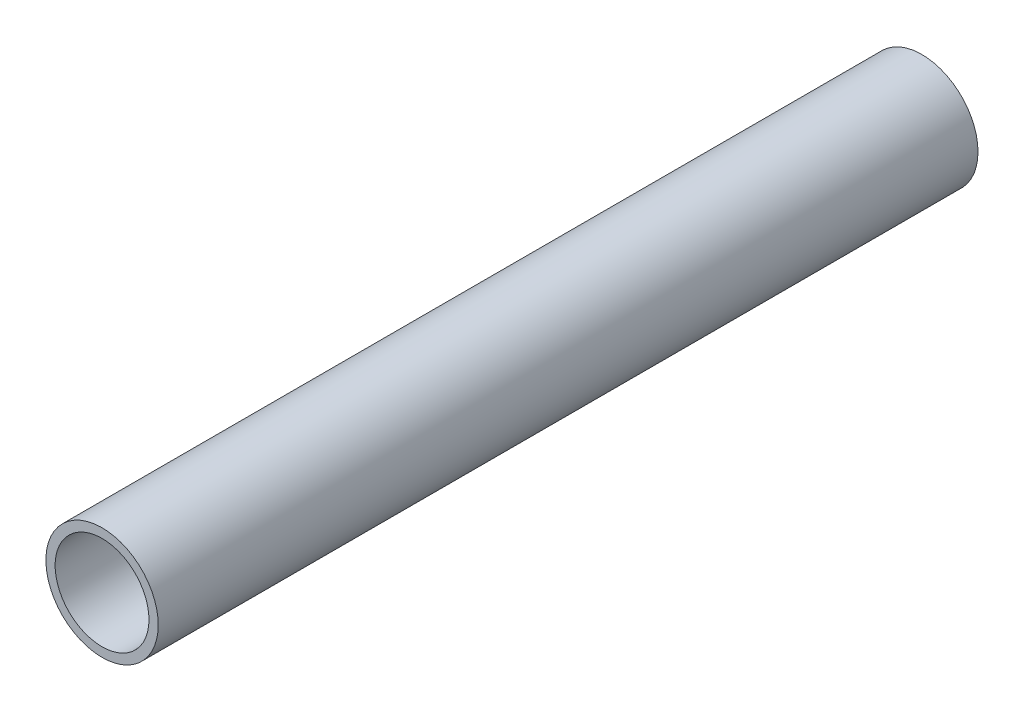
ISO-10303-21;
HEADER;
FILE_DESCRIPTION(('STEP AP214'),'2;1');
FILE_NAME('part.step','',(''),(''),'','','');
FILE_SCHEMA(('AUTOMOTIVE_DESIGN { 1 0 10303 214 1 1 1 1 }'));
ENDSEC;
DATA;
#1=APPLICATION_CONTEXT('core data for automotive mechanical design processes');
#2=APPLICATION_PROTOCOL_DEFINITION('international standard','automotive_design',2000,#1);
#3=PRODUCT_CONTEXT('',#1,'mechanical');
#4=PRODUCT('Part','Part','',(#3));
#5=PRODUCT_RELATED_PRODUCT_CATEGORY('part','',(#4));
#6=PRODUCT_DEFINITION_FORMATION('','',#4);
#7=PRODUCT_DEFINITION_CONTEXT('part definition',#1,'design');
#8=PRODUCT_DEFINITION('design','',#6,#7);
#9=PRODUCT_DEFINITION_SHAPE('','',#8);
#10=(LENGTH_UNIT() NAMED_UNIT(*) SI_UNIT(.MILLI.,.METRE.));
#11=(NAMED_UNIT(*) PLANE_ANGLE_UNIT() SI_UNIT($,.RADIAN.));
#12=(NAMED_UNIT(*) SI_UNIT($,.STERADIAN.) SOLID_ANGLE_UNIT());
#13=UNCERTAINTY_MEASURE_WITH_UNIT(LENGTH_MEASURE(1.E-05),#10,'distance_accuracy_value','');
#14=(GEOMETRIC_REPRESENTATION_CONTEXT(3) GLOBAL_UNCERTAINTY_ASSIGNED_CONTEXT((#13)) GLOBAL_UNIT_ASSIGNED_CONTEXT((#10,
#11,#12)) REPRESENTATION_CONTEXT('',''));
#15=CARTESIAN_POINT('',(0.,0.,0.));
#16=DIRECTION('',(0.,0.,1.));
#17=DIRECTION('',(1.,0.,0.));
#18=AXIS2_PLACEMENT_3D('',#15,#16,#17);
#19=CARTESIAN_POINT('',(0.,0.,239.522));
#20=DIRECTION('',(0.,0.,1.));
#21=DIRECTION('',(1.,0.,0.));
#22=AXIS2_PLACEMENT_3D('',#19,#20,#21);
#23=PLANE('',#22);
#24=CARTESIAN_POINT('',(0.,0.,239.522));
#25=DIRECTION('',(0.,0.,1.));
#26=DIRECTION('',(1.,0.,0.));
#27=AXIS2_PLACEMENT_3D('',#24,#25,#26);
#28=CIRCLE('',#27,16.409885889759);
#29=CARTESIAN_POINT('',(16.409885889759,0.,239.522));
#30=VERTEX_POINT('',#29);
#31=EDGE_CURVE('E12',#30,#30,#28,.T.);
#32=ORIENTED_EDGE('',*,*,#31,.T.);
#33=EDGE_LOOP('',(#32));
#34=FACE_BOUND('',#33,.T.);
#35=CARTESIAN_POINT('',(0.,0.,239.522));
#36=DIRECTION('',(0.,0.,1.));
#37=DIRECTION('',(1.,0.,0.));
#38=AXIS2_PLACEMENT_3D('',#35,#36,#37);
#39=CIRCLE('',#38,13.7107938655238);
#40=CARTESIAN_POINT('',(13.7107938655238,0.,239.522));
#41=VERTEX_POINT('',#40);
#42=EDGE_CURVE('E52',#41,#41,#39,.T.);
#43=ORIENTED_EDGE('',*,*,#42,.F.);
#44=EDGE_LOOP('',(#43));
#45=FACE_BOUND('',#44,.T.);
#46=ADVANCED_FACE('F41',(#34,#45),#23,.T.);
#47=CARTESIAN_POINT('',(0.,0.,0.));
#48=DIRECTION('',(0.,0.,1.));
#49=DIRECTION('',(1.,0.,0.));
#50=AXIS2_PLACEMENT_3D('',#47,#48,#49);
#51=PLANE('',#50);
#52=CARTESIAN_POINT('',(0.,0.,0.));
#53=DIRECTION('',(0.,0.,1.));
#54=DIRECTION('',(1.,0.,0.));
#55=AXIS2_PLACEMENT_3D('',#52,#53,#54);
#56=CIRCLE('',#55,16.409885889759);
#57=CARTESIAN_POINT('',(16.409885889759,0.,0.));
#58=VERTEX_POINT('',#57);
#59=EDGE_CURVE('E45',#58,#58,#56,.T.);
#60=ORIENTED_EDGE('',*,*,#59,.F.);
#61=EDGE_LOOP('',(#60));
#62=FACE_BOUND('',#61,.T.);
#63=CARTESIAN_POINT('',(0.,0.,0.));
#64=DIRECTION('',(0.,0.,1.));
#65=DIRECTION('',(1.,0.,0.));
#66=AXIS2_PLACEMENT_3D('',#63,#64,#65);
#67=CIRCLE('',#66,13.7107938655238);
#68=CARTESIAN_POINT('',(13.7107938655238,0.,0.));
#69=VERTEX_POINT('',#68);
#70=EDGE_CURVE('E54',#69,#69,#67,.T.);
#71=ORIENTED_EDGE('',*,*,#70,.T.);
#72=EDGE_LOOP('',(#71));
#73=FACE_BOUND('',#72,.T.);
#74=ADVANCED_FACE('F64',(#62,#73),#51,.F.);
#75=CARTESIAN_POINT('',(0.,0.,239.522));
#76=DIRECTION('',(0.,0.,-1.));
#77=DIRECTION('',(-1.,0.,0.));
#78=AXIS2_PLACEMENT_3D('',#75,#76,#77);
#79=CYLINDRICAL_SURFACE('',#78,16.409885889759);
#80=ORIENTED_EDGE('',*,*,#31,.F.);
#81=EDGE_LOOP('',(#80));
#82=FACE_BOUND('',#81,.T.);
#83=ORIENTED_EDGE('',*,*,#59,.T.);
#84=EDGE_LOOP('',(#83));
#85=FACE_BOUND('',#84,.T.);
#86=ADVANCED_FACE('F43',(#82,#85),#79,.T.);
#87=CARTESIAN_POINT('',(0.,0.,239.522));
#88=DIRECTION('',(0.,0.,-1.));
#89=DIRECTION('',(-1.,0.,0.));
#90=AXIS2_PLACEMENT_3D('',#87,#88,#89);
#91=CYLINDRICAL_SURFACE('',#90,13.7107938655238);
#92=ORIENTED_EDGE('',*,*,#42,.T.);
#93=EDGE_LOOP('',(#92));
#94=FACE_BOUND('',#93,.T.);
#95=ORIENTED_EDGE('',*,*,#70,.F.);
#96=EDGE_LOOP('',(#95));
#97=FACE_BOUND('',#96,.T.);
#98=ADVANCED_FACE('F60',(#94,#97),#91,.F.);
#99=CLOSED_SHELL('',(#46,#74,#86,#98));
#100=MANIFOLD_SOLID_BREP('B2',#99);
#101=ADVANCED_BREP_SHAPE_REPRESENTATION('',(#18,#100),#14);
#102=SHAPE_DEFINITION_REPRESENTATION(#9,#101);
ENDSEC;
END-ISO-10303-21;
